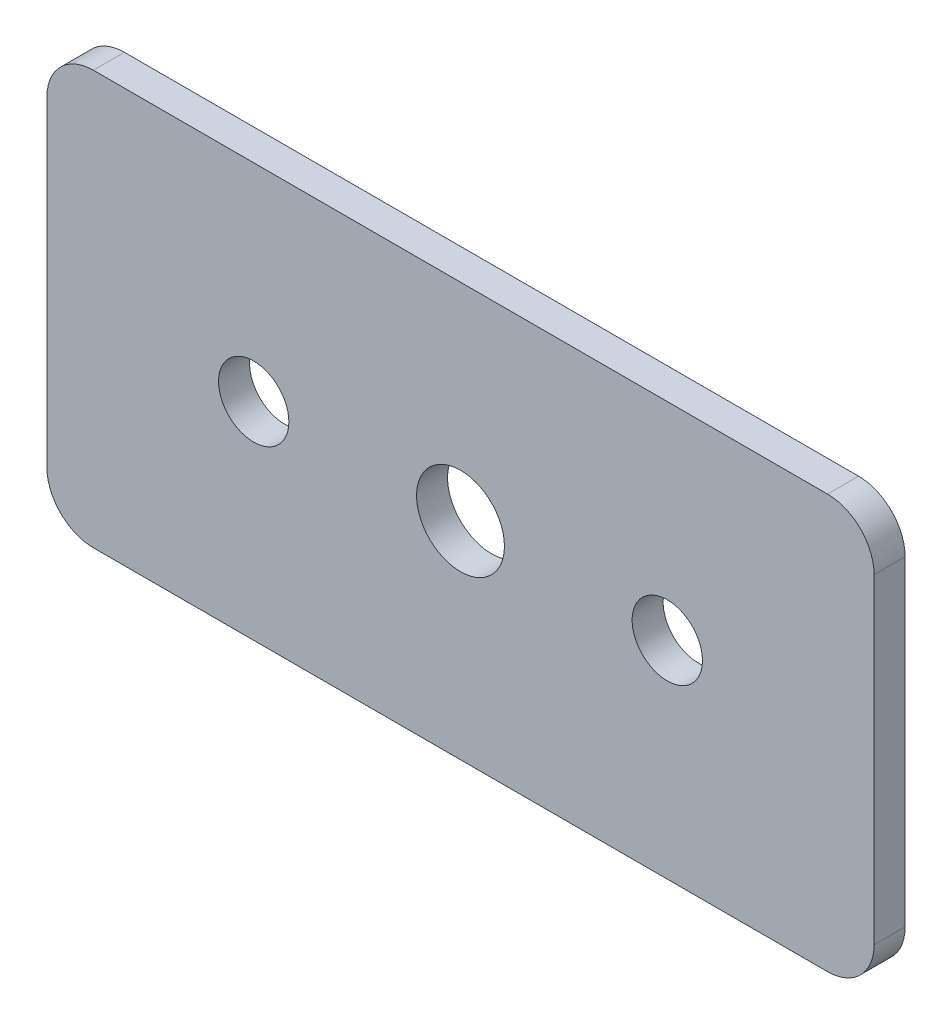
ISO-10303-21;
HEADER;
FILE_DESCRIPTION(('STEP AP214'),'2;1');
FILE_NAME('part.step','',(''),(''),'','','');
FILE_SCHEMA(('AUTOMOTIVE_DESIGN { 1 0 10303 214 1 1 1 1 }'));
ENDSEC;
DATA;
#1=APPLICATION_CONTEXT('core data for automotive mechanical design processes');
#2=APPLICATION_PROTOCOL_DEFINITION('international standard','automotive_design',2000,#1);
#3=PRODUCT_CONTEXT('',#1,'mechanical');
#4=PRODUCT('Part','Part','',(#3));
#5=PRODUCT_RELATED_PRODUCT_CATEGORY('part','',(#4));
#6=PRODUCT_DEFINITION_FORMATION('','',#4);
#7=PRODUCT_DEFINITION_CONTEXT('part definition',#1,'design');
#8=PRODUCT_DEFINITION('design','',#6,#7);
#9=PRODUCT_DEFINITION_SHAPE('','',#8);
#10=(LENGTH_UNIT() NAMED_UNIT(*) SI_UNIT(.MILLI.,.METRE.));
#11=(NAMED_UNIT(*) PLANE_ANGLE_UNIT() SI_UNIT($,.RADIAN.));
#12=(NAMED_UNIT(*) SI_UNIT($,.STERADIAN.) SOLID_ANGLE_UNIT());
#13=UNCERTAINTY_MEASURE_WITH_UNIT(LENGTH_MEASURE(1.E-05),#10,'distance_accuracy_value','');
#14=(GEOMETRIC_REPRESENTATION_CONTEXT(3) GLOBAL_UNCERTAINTY_ASSIGNED_CONTEXT((#13)) GLOBAL_UNIT_ASSIGNED_CONTEXT((#10,
#11,#12)) REPRESENTATION_CONTEXT('',''));
#15=CARTESIAN_POINT('',(0.,0.,0.));
#16=DIRECTION('',(0.,0.,1.));
#17=DIRECTION('',(1.,0.,0.));
#18=AXIS2_PLACEMENT_3D('',#15,#16,#17);
#19=CARTESIAN_POINT('',(40.,20.,-3.));
#20=DIRECTION('',(1.,0.,0.));
#21=DIRECTION('',(0.,1.,0.));
#22=AXIS2_PLACEMENT_3D('',#19,#20,#21);
#23=PLANE('',#22);
#24=DIRECTION('',(0.,1.,0.));
#25=VECTOR('',#24,1.);
#26=CARTESIAN_POINT('',(40.,20.,0.));
#27=LINE('',#26,#25);
#28=CARTESIAN_POINT('',(40.,-15.5,0.));
#29=VERTEX_POINT('',#28);
#30=CARTESIAN_POINT('',(40.,15.5,0.));
#31=VERTEX_POINT('',#30);
#32=EDGE_CURVE('E173',#29,#31,#27,.T.);
#33=ORIENTED_EDGE('',*,*,#32,.F.);
#34=DIRECTION('',(0.,0.,1.));
#35=VECTOR('',#34,1.);
#36=CARTESIAN_POINT('',(40.,-15.5,-3.));
#37=LINE('',#36,#35);
#38=CARTESIAN_POINT('',(40.,-15.5,-3.));
#39=VERTEX_POINT('',#38);
#40=EDGE_CURVE('E153',#29,#39,#37,.F.);
#41=ORIENTED_EDGE('',*,*,#40,.T.);
#42=DIRECTION('',(0.,1.,0.));
#43=VECTOR('',#42,1.);
#44=CARTESIAN_POINT('',(40.,20.,-3.));
#45=LINE('',#44,#43);
#46=CARTESIAN_POINT('',(40.,15.5,-3.));
#47=VERTEX_POINT('',#46);
#48=EDGE_CURVE('E134',#39,#47,#45,.T.);
#49=ORIENTED_EDGE('',*,*,#48,.T.);
#50=DIRECTION('',(0.,0.,1.));
#51=VECTOR('',#50,1.);
#52=CARTESIAN_POINT('',(40.,15.5,-3.));
#53=LINE('',#52,#51);
#54=EDGE_CURVE('E150',#47,#31,#53,.T.);
#55=ORIENTED_EDGE('',*,*,#54,.T.);
#56=EDGE_LOOP('',(#33,#41,#49,#55));
#57=FACE_BOUND('',#56,.T.);
#58=ADVANCED_FACE('F47',(#57),#23,.T.);
#59=CARTESIAN_POINT('',(-40.,-20.,-3.));
#60=DIRECTION('',(0.,-1.,0.));
#61=DIRECTION('',(0.,0.,-1.));
#62=AXIS2_PLACEMENT_3D('',#59,#60,#61);
#63=PLANE('',#62);
#64=DIRECTION('',(1.,0.,0.));
#65=VECTOR('',#64,1.);
#66=CARTESIAN_POINT('',(-40.,-20.,-3.));
#67=LINE('',#66,#65);
#68=CARTESIAN_POINT('',(-35.5,-20.,-3.));
#69=VERTEX_POINT('',#68);
#70=CARTESIAN_POINT('',(35.5,-20.,-3.));
#71=VERTEX_POINT('',#70);
#72=EDGE_CURVE('E139',#69,#71,#67,.T.);
#73=ORIENTED_EDGE('',*,*,#72,.T.);
#74=DIRECTION('',(0.,0.,1.));
#75=VECTOR('',#74,1.);
#76=CARTESIAN_POINT('',(35.5,-20.,-3.));
#77=LINE('',#76,#75);
#78=CARTESIAN_POINT('',(35.5,-20.,0.));
#79=VERTEX_POINT('',#78);
#80=EDGE_CURVE('E133',#71,#79,#77,.T.);
#81=ORIENTED_EDGE('',*,*,#80,.T.);
#82=DIRECTION('',(1.,0.,0.));
#83=VECTOR('',#82,1.);
#84=CARTESIAN_POINT('',(-40.,-20.,0.));
#85=LINE('',#84,#83);
#86=CARTESIAN_POINT('',(-35.5,-20.,0.));
#87=VERTEX_POINT('',#86);
#88=EDGE_CURVE('E116',#87,#79,#85,.T.);
#89=ORIENTED_EDGE('',*,*,#88,.F.);
#90=DIRECTION('',(0.,0.,1.));
#91=VECTOR('',#90,1.);
#92=CARTESIAN_POINT('',(-35.5,-20.,-3.));
#93=LINE('',#92,#91);
#94=EDGE_CURVE('E130',#87,#69,#93,.F.);
#95=ORIENTED_EDGE('',*,*,#94,.T.);
#96=EDGE_LOOP('',(#73,#81,#89,#95));
#97=FACE_BOUND('',#96,.T.);
#98=ADVANCED_FACE('F129',(#97),#63,.T.);
#99=CARTESIAN_POINT('',(-40.,20.,-3.));
#100=DIRECTION('',(-1.,0.,0.));
#101=DIRECTION('',(0.,-1.,0.));
#102=AXIS2_PLACEMENT_3D('',#99,#100,#101);
#103=PLANE('',#102);
#104=DIRECTION('',(0.,-1.,0.));
#105=VECTOR('',#104,1.);
#106=CARTESIAN_POINT('',(-40.,20.,-3.));
#107=LINE('',#106,#105);
#108=CARTESIAN_POINT('',(-40.,15.5,-3.));
#109=VERTEX_POINT('',#108);
#110=CARTESIAN_POINT('',(-40.,-15.5,-3.));
#111=VERTEX_POINT('',#110);
#112=EDGE_CURVE('E143',#109,#111,#107,.T.);
#113=ORIENTED_EDGE('',*,*,#112,.T.);
#114=DIRECTION('',(0.,0.,1.));
#115=VECTOR('',#114,1.);
#116=CARTESIAN_POINT('',(-40.,-15.5,-3.));
#117=LINE('',#116,#115);
#118=CARTESIAN_POINT('',(-40.,-15.5,0.));
#119=VERTEX_POINT('',#118);
#120=EDGE_CURVE('E163',#111,#119,#117,.T.);
#121=ORIENTED_EDGE('',*,*,#120,.T.);
#122=DIRECTION('',(0.,-1.,0.));
#123=VECTOR('',#122,1.);
#124=CARTESIAN_POINT('',(-40.,20.,0.));
#125=LINE('',#124,#123);
#126=CARTESIAN_POINT('',(-40.,15.5,0.));
#127=VERTEX_POINT('',#126);
#128=EDGE_CURVE('E118',#127,#119,#125,.T.);
#129=ORIENTED_EDGE('',*,*,#128,.F.);
#130=DIRECTION('',(0.,0.,1.));
#131=VECTOR('',#130,1.);
#132=CARTESIAN_POINT('',(-40.,15.5,-3.));
#133=LINE('',#132,#131);
#134=EDGE_CURVE('E161',#127,#109,#133,.F.);
#135=ORIENTED_EDGE('',*,*,#134,.T.);
#136=EDGE_LOOP('',(#113,#121,#129,#135));
#137=FACE_BOUND('',#136,.T.);
#138=ADVANCED_FACE('F166',(#137),#103,.T.);
#139=CARTESIAN_POINT('',(-40.,20.,-3.));
#140=DIRECTION('',(0.,1.,0.));
#141=DIRECTION('',(0.,0.,1.));
#142=AXIS2_PLACEMENT_3D('',#139,#140,#141);
#143=PLANE('',#142);
#144=DIRECTION('',(-1.,0.,0.));
#145=VECTOR('',#144,1.);
#146=CARTESIAN_POINT('',(-40.,20.,-3.));
#147=LINE('',#146,#145);
#148=CARTESIAN_POINT('',(35.5,20.,-3.));
#149=VERTEX_POINT('',#148);
#150=CARTESIAN_POINT('',(-35.5,20.,-3.));
#151=VERTEX_POINT('',#150);
#152=EDGE_CURVE('E168',#149,#151,#147,.T.);
#153=ORIENTED_EDGE('',*,*,#152,.T.);
#154=DIRECTION('',(0.,0.,1.));
#155=VECTOR('',#154,1.);
#156=CARTESIAN_POINT('',(-35.5,20.,-3.));
#157=LINE('',#156,#155);
#158=CARTESIAN_POINT('',(-35.5,20.,0.));
#159=VERTEX_POINT('',#158);
#160=EDGE_CURVE('E11',#151,#159,#157,.T.);
#161=ORIENTED_EDGE('',*,*,#160,.T.);
#162=DIRECTION('',(-1.,0.,0.));
#163=VECTOR('',#162,1.);
#164=CARTESIAN_POINT('',(-40.,20.,0.));
#165=LINE('',#164,#163);
#166=CARTESIAN_POINT('',(35.5,20.,0.));
#167=VERTEX_POINT('',#166);
#168=EDGE_CURVE('E176',#167,#159,#165,.T.);
#169=ORIENTED_EDGE('',*,*,#168,.F.);
#170=DIRECTION('',(0.,0.,1.));
#171=VECTOR('',#170,1.);
#172=CARTESIAN_POINT('',(35.5,20.,-3.));
#173=LINE('',#172,#171);
#174=EDGE_CURVE('E55',#167,#149,#173,.F.);
#175=ORIENTED_EDGE('',*,*,#174,.T.);
#176=EDGE_LOOP('',(#153,#161,#169,#175));
#177=FACE_BOUND('',#176,.T.);
#178=ADVANCED_FACE('F179',(#177),#143,.T.);
#179=CARTESIAN_POINT('',(0.,0.,-3.));
#180=DIRECTION('',(0.,0.,1.));
#181=DIRECTION('',(1.,0.,0.));
#182=AXIS2_PLACEMENT_3D('',#179,#180,#181);
#183=PLANE('',#182);
#184=CARTESIAN_POINT('',(0.,0.,-3.));
#185=DIRECTION('',(0.,0.,1.));
#186=DIRECTION('',(1.,0.,0.));
#187=AXIS2_PLACEMENT_3D('',#184,#185,#186);
#188=CIRCLE('',#187,4.24999999999999);
#189=CARTESIAN_POINT('',(4.24999999999999,0.,-3.));
#190=VERTEX_POINT('',#189);
#191=EDGE_CURVE('E203',#190,#190,#188,.T.);
#192=ORIENTED_EDGE('',*,*,#191,.T.);
#193=EDGE_LOOP('',(#192));
#194=FACE_BOUND('',#193,.T.);
#195=CARTESIAN_POINT('',(20.,0.,-3.));
#196=DIRECTION('',(0.,0.,1.));
#197=DIRECTION('',(1.,0.,0.));
#198=AXIS2_PLACEMENT_3D('',#195,#196,#197);
#199=CIRCLE('',#198,3.4);
#200=CARTESIAN_POINT('',(23.4,0.,-3.));
#201=VERTEX_POINT('',#200);
#202=EDGE_CURVE('E197',#201,#201,#199,.T.);
#203=ORIENTED_EDGE('',*,*,#202,.T.);
#204=EDGE_LOOP('',(#203));
#205=FACE_BOUND('',#204,.T.);
#206=CARTESIAN_POINT('',(-20.,0.,-3.));
#207=DIRECTION('',(0.,0.,1.));
#208=DIRECTION('',(1.,0.,0.));
#209=AXIS2_PLACEMENT_3D('',#206,#207,#208);
#210=CIRCLE('',#209,3.4);
#211=CARTESIAN_POINT('',(-16.6,0.,-3.));
#212=VERTEX_POINT('',#211);
#213=EDGE_CURVE('E177',#212,#212,#210,.T.);
#214=ORIENTED_EDGE('',*,*,#213,.T.);
#215=EDGE_LOOP('',(#214));
#216=FACE_BOUND('',#215,.T.);
#217=ORIENTED_EDGE('',*,*,#48,.F.);
#218=CARTESIAN_POINT('',(35.5,-15.5,-3.));
#219=DIRECTION('',(0.,0.,1.));
#220=DIRECTION('',(1.,0.,0.));
#221=AXIS2_PLACEMENT_3D('',#218,#219,#220);
#222=CIRCLE('',#221,4.5);
#223=EDGE_CURVE('E159',#39,#71,#222,.F.);
#224=ORIENTED_EDGE('',*,*,#223,.T.);
#225=ORIENTED_EDGE('',*,*,#72,.F.);
#226=CARTESIAN_POINT('',(-35.5,-15.5,-3.));
#227=DIRECTION('',(0.,0.,1.));
#228=DIRECTION('',(1.,0.,0.));
#229=AXIS2_PLACEMENT_3D('',#226,#227,#228);
#230=CIRCLE('',#229,4.5);
#231=EDGE_CURVE('E138',#69,#111,#230,.F.);
#232=ORIENTED_EDGE('',*,*,#231,.T.);
#233=ORIENTED_EDGE('',*,*,#112,.F.);
#234=CARTESIAN_POINT('',(-35.5,15.5,-3.));
#235=DIRECTION('',(0.,0.,1.));
#236=DIRECTION('',(1.,0.,0.));
#237=AXIS2_PLACEMENT_3D('',#234,#235,#236);
#238=CIRCLE('',#237,4.5);
#239=EDGE_CURVE('E62',#109,#151,#238,.F.);
#240=ORIENTED_EDGE('',*,*,#239,.T.);
#241=ORIENTED_EDGE('',*,*,#152,.F.);
#242=CARTESIAN_POINT('',(35.5,15.5,-3.));
#243=DIRECTION('',(0.,0.,1.));
#244=DIRECTION('',(1.,0.,0.));
#245=AXIS2_PLACEMENT_3D('',#242,#243,#244);
#246=CIRCLE('',#245,4.5);
#247=EDGE_CURVE('E155',#149,#47,#246,.F.);
#248=ORIENTED_EDGE('',*,*,#247,.T.);
#249=EDGE_LOOP('',(#217,#224,#225,#232,#233,#240,#241,#248));
#250=FACE_BOUND('',#249,.T.);
#251=ADVANCED_FACE('F186',(#194,#205,#216,#250),#183,.F.);
#252=CARTESIAN_POINT('',(0.,0.,0.));
#253=DIRECTION('',(0.,0.,1.));
#254=DIRECTION('',(1.,0.,0.));
#255=AXIS2_PLACEMENT_3D('',#252,#253,#254);
#256=PLANE('',#255);
#257=CARTESIAN_POINT('',(0.,0.,0.));
#258=DIRECTION('',(0.,0.,1.));
#259=DIRECTION('',(1.,0.,0.));
#260=AXIS2_PLACEMENT_3D('',#257,#258,#259);
#261=CIRCLE('',#260,4.24999999999999);
#262=CARTESIAN_POINT('',(4.24999999999999,0.,0.));
#263=VERTEX_POINT('',#262);
#264=EDGE_CURVE('E206',#263,#263,#261,.T.);
#265=ORIENTED_EDGE('',*,*,#264,.F.);
#266=EDGE_LOOP('',(#265));
#267=FACE_BOUND('',#266,.T.);
#268=CARTESIAN_POINT('',(20.,0.,0.));
#269=DIRECTION('',(0.,0.,1.));
#270=DIRECTION('',(1.,0.,0.));
#271=AXIS2_PLACEMENT_3D('',#268,#269,#270);
#272=CIRCLE('',#271,3.4);
#273=CARTESIAN_POINT('',(23.4,0.,0.));
#274=VERTEX_POINT('',#273);
#275=EDGE_CURVE('E200',#274,#274,#272,.T.);
#276=ORIENTED_EDGE('',*,*,#275,.F.);
#277=EDGE_LOOP('',(#276));
#278=FACE_BOUND('',#277,.T.);
#279=CARTESIAN_POINT('',(-20.,0.,0.));
#280=DIRECTION('',(0.,0.,1.));
#281=DIRECTION('',(1.,0.,0.));
#282=AXIS2_PLACEMENT_3D('',#279,#280,#281);
#283=CIRCLE('',#282,3.4);
#284=CARTESIAN_POINT('',(-16.6,0.,0.));
#285=VERTEX_POINT('',#284);
#286=EDGE_CURVE('E194',#285,#285,#283,.T.);
#287=ORIENTED_EDGE('',*,*,#286,.F.);
#288=EDGE_LOOP('',(#287));
#289=FACE_BOUND('',#288,.T.);
#290=ORIENTED_EDGE('',*,*,#88,.T.);
#291=CARTESIAN_POINT('',(35.5,-15.5,0.));
#292=DIRECTION('',(0.,0.,1.));
#293=DIRECTION('',(1.,0.,0.));
#294=AXIS2_PLACEMENT_3D('',#291,#292,#293);
#295=CIRCLE('',#294,4.5);
#296=EDGE_CURVE('E123',#79,#29,#295,.T.);
#297=ORIENTED_EDGE('',*,*,#296,.T.);
#298=ORIENTED_EDGE('',*,*,#32,.T.);
#299=CARTESIAN_POINT('',(35.5,15.5,0.));
#300=DIRECTION('',(0.,0.,1.));
#301=DIRECTION('',(1.,0.,0.));
#302=AXIS2_PLACEMENT_3D('',#299,#300,#301);
#303=CIRCLE('',#302,4.5);
#304=EDGE_CURVE('E141',#31,#167,#303,.T.);
#305=ORIENTED_EDGE('',*,*,#304,.T.);
#306=ORIENTED_EDGE('',*,*,#168,.T.);
#307=CARTESIAN_POINT('',(-35.5,15.5,0.));
#308=DIRECTION('',(0.,0.,1.));
#309=DIRECTION('',(1.,0.,0.));
#310=AXIS2_PLACEMENT_3D('',#307,#308,#309);
#311=CIRCLE('',#310,4.5);
#312=EDGE_CURVE('E124',#159,#127,#311,.T.);
#313=ORIENTED_EDGE('',*,*,#312,.T.);
#314=ORIENTED_EDGE('',*,*,#128,.T.);
#315=CARTESIAN_POINT('',(-35.5,-15.5,0.));
#316=DIRECTION('',(0.,0.,1.));
#317=DIRECTION('',(1.,0.,0.));
#318=AXIS2_PLACEMENT_3D('',#315,#316,#317);
#319=CIRCLE('',#318,4.5);
#320=EDGE_CURVE('E113',#119,#87,#319,.T.);
#321=ORIENTED_EDGE('',*,*,#320,.T.);
#322=EDGE_LOOP('',(#290,#297,#298,#305,#306,#313,#314,#321));
#323=FACE_BOUND('',#322,.T.);
#324=ADVANCED_FACE('F115',(#267,#278,#289,#323),#256,.T.);
#325=CARTESIAN_POINT('',(35.5,-15.5,-3.));
#326=DIRECTION('',(0.,0.,1.));
#327=DIRECTION('',(1.,0.,0.));
#328=AXIS2_PLACEMENT_3D('',#325,#326,#327);
#329=CYLINDRICAL_SURFACE('',#328,4.5);
#330=ORIENTED_EDGE('',*,*,#223,.F.);
#331=ORIENTED_EDGE('',*,*,#40,.F.);
#332=ORIENTED_EDGE('',*,*,#296,.F.);
#333=ORIENTED_EDGE('',*,*,#80,.F.);
#334=EDGE_LOOP('',(#330,#331,#332,#333));
#335=FACE_BOUND('',#334,.T.);
#336=ADVANCED_FACE('F214',(#335),#329,.T.);
#337=CARTESIAN_POINT('',(-35.5,-15.5,-3.));
#338=DIRECTION('',(0.,0.,1.));
#339=DIRECTION('',(1.,0.,0.));
#340=AXIS2_PLACEMENT_3D('',#337,#338,#339);
#341=CYLINDRICAL_SURFACE('',#340,4.5);
#342=ORIENTED_EDGE('',*,*,#231,.F.);
#343=ORIENTED_EDGE('',*,*,#94,.F.);
#344=ORIENTED_EDGE('',*,*,#320,.F.);
#345=ORIENTED_EDGE('',*,*,#120,.F.);
#346=EDGE_LOOP('',(#342,#343,#344,#345));
#347=FACE_BOUND('',#346,.T.);
#348=ADVANCED_FACE('F137',(#347),#341,.T.);
#349=CARTESIAN_POINT('',(-35.5,15.5,-3.));
#350=DIRECTION('',(0.,0.,1.));
#351=DIRECTION('',(1.,0.,0.));
#352=AXIS2_PLACEMENT_3D('',#349,#350,#351);
#353=CYLINDRICAL_SURFACE('',#352,4.5);
#354=ORIENTED_EDGE('',*,*,#239,.F.);
#355=ORIENTED_EDGE('',*,*,#134,.F.);
#356=ORIENTED_EDGE('',*,*,#312,.F.);
#357=ORIENTED_EDGE('',*,*,#160,.F.);
#358=EDGE_LOOP('',(#354,#355,#356,#357));
#359=FACE_BOUND('',#358,.T.);
#360=ADVANCED_FACE('F232',(#359),#353,.T.);
#361=CARTESIAN_POINT('',(35.5,15.5,-3.));
#362=DIRECTION('',(0.,0.,1.));
#363=DIRECTION('',(1.,0.,0.));
#364=AXIS2_PLACEMENT_3D('',#361,#362,#363);
#365=CYLINDRICAL_SURFACE('',#364,4.5);
#366=ORIENTED_EDGE('',*,*,#247,.F.);
#367=ORIENTED_EDGE('',*,*,#174,.F.);
#368=ORIENTED_EDGE('',*,*,#304,.F.);
#369=ORIENTED_EDGE('',*,*,#54,.F.);
#370=EDGE_LOOP('',(#366,#367,#368,#369));
#371=FACE_BOUND('',#370,.T.);
#372=ADVANCED_FACE('F49',(#371),#365,.T.);
#373=CARTESIAN_POINT('',(-20.,0.,0.));
#374=DIRECTION('',(0.,0.,1.));
#375=DIRECTION('',(1.,0.,0.));
#376=AXIS2_PLACEMENT_3D('',#373,#374,#375);
#377=CYLINDRICAL_SURFACE('',#376,3.4);
#378=ORIENTED_EDGE('',*,*,#213,.F.);
#379=EDGE_LOOP('',(#378));
#380=FACE_BOUND('',#379,.T.);
#381=ORIENTED_EDGE('',*,*,#286,.T.);
#382=EDGE_LOOP('',(#381));
#383=FACE_BOUND('',#382,.T.);
#384=ADVANCED_FACE('F220',(#380,#383),#377,.F.);
#385=CARTESIAN_POINT('',(20.,0.,0.));
#386=DIRECTION('',(0.,0.,1.));
#387=DIRECTION('',(1.,0.,0.));
#388=AXIS2_PLACEMENT_3D('',#385,#386,#387);
#389=CYLINDRICAL_SURFACE('',#388,3.4);
#390=ORIENTED_EDGE('',*,*,#202,.F.);
#391=EDGE_LOOP('',(#390));
#392=FACE_BOUND('',#391,.T.);
#393=ORIENTED_EDGE('',*,*,#275,.T.);
#394=EDGE_LOOP('',(#393));
#395=FACE_BOUND('',#394,.T.);
#396=ADVANCED_FACE('F222',(#392,#395),#389,.F.);
#397=CARTESIAN_POINT('',(0.,0.,0.));
#398=DIRECTION('',(0.,0.,1.));
#399=DIRECTION('',(1.,0.,0.));
#400=AXIS2_PLACEMENT_3D('',#397,#398,#399);
#401=CYLINDRICAL_SURFACE('',#400,4.24999999999999);
#402=ORIENTED_EDGE('',*,*,#191,.F.);
#403=EDGE_LOOP('',(#402));
#404=FACE_BOUND('',#403,.T.);
#405=ORIENTED_EDGE('',*,*,#264,.T.);
#406=EDGE_LOOP('',(#405));
#407=FACE_BOUND('',#406,.T.);
#408=ADVANCED_FACE('F210',(#404,#407),#401,.F.);
#409=CLOSED_SHELL('',(#58,#98,#138,#178,#251,#324,#336,#348,#360,#372,#384,#396,#408));
#410=MANIFOLD_SOLID_BREP('B2',#409);
#411=ADVANCED_BREP_SHAPE_REPRESENTATION('',(#18,#410),#14);
#412=SHAPE_DEFINITION_REPRESENTATION(#9,#411);
ENDSEC;
END-ISO-10303-21;
